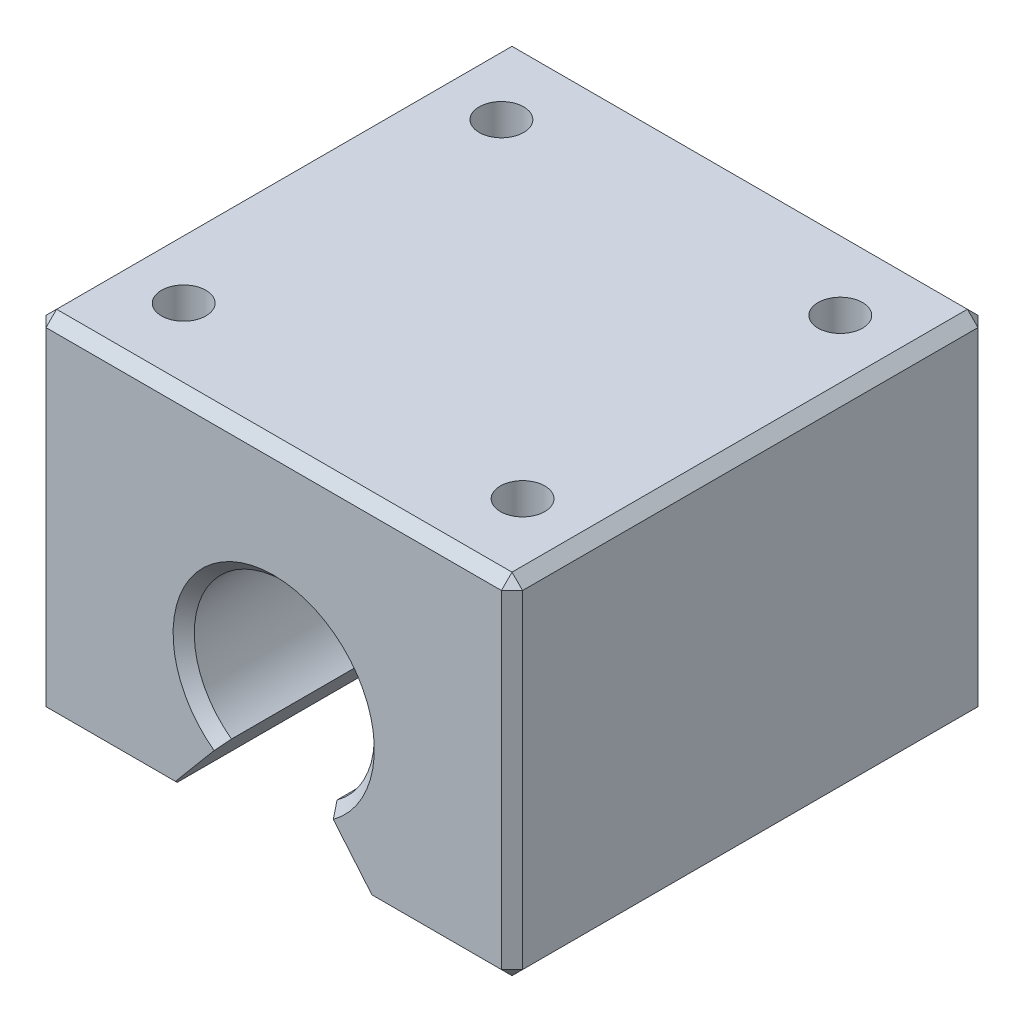
ISO-10303-21;
HEADER;
FILE_DESCRIPTION(('STEP AP214'),'2;1');
FILE_NAME('part.step','',(''),(''),'','','');
FILE_SCHEMA(('AUTOMOTIVE_DESIGN { 1 0 10303 214 1 1 1 1 }'));
ENDSEC;
DATA;
#1=APPLICATION_CONTEXT('core data for automotive mechanical design processes');
#2=APPLICATION_PROTOCOL_DEFINITION('international standard','automotive_design',2000,#1);
#3=PRODUCT_CONTEXT('',#1,'mechanical');
#4=PRODUCT('Part','Part','',(#3));
#5=PRODUCT_RELATED_PRODUCT_CATEGORY('part','',(#4));
#6=PRODUCT_DEFINITION_FORMATION('','',#4);
#7=PRODUCT_DEFINITION_CONTEXT('part definition',#1,'design');
#8=PRODUCT_DEFINITION('design','',#6,#7);
#9=PRODUCT_DEFINITION_SHAPE('','',#8);
#10=(LENGTH_UNIT() NAMED_UNIT(*) SI_UNIT(.MILLI.,.METRE.));
#11=(NAMED_UNIT(*) PLANE_ANGLE_UNIT() SI_UNIT($,.RADIAN.));
#12=(NAMED_UNIT(*) SI_UNIT($,.STERADIAN.) SOLID_ANGLE_UNIT());
#13=UNCERTAINTY_MEASURE_WITH_UNIT(LENGTH_MEASURE(1.E-05),#10,'distance_accuracy_value','');
#14=(GEOMETRIC_REPRESENTATION_CONTEXT(3) GLOBAL_UNCERTAINTY_ASSIGNED_CONTEXT((#13)) GLOBAL_UNIT_ASSIGNED_CONTEXT((#10,
#11,#12)) REPRESENTATION_CONTEXT('',''));
#15=CARTESIAN_POINT('',(0.,0.,0.));
#16=DIRECTION('',(0.,0.,1.));
#17=DIRECTION('',(1.,0.,0.));
#18=AXIS2_PLACEMENT_3D('',#15,#16,#17);
#19=CARTESIAN_POINT('',(-22.5,-16.5,45.));
#20=DIRECTION('',(0.,1.,0.));
#21=DIRECTION('',(0.,0.,1.));
#22=AXIS2_PLACEMENT_3D('',#19,#20,#21);
#23=PLANE('',#22);
#24=DIRECTION('',(0.,0.,1.));
#25=VECTOR('',#24,1.);
#26=CARTESIAN_POINT('',(21.5,-16.5,45.));
#27=LINE('',#26,#25);
#28=CARTESIAN_POINT('',(21.5,-16.5,1.));
#29=VERTEX_POINT('',#28);
#30=CARTESIAN_POINT('',(21.5,-16.5,44.));
#31=VERTEX_POINT('',#30);
#32=EDGE_CURVE('E337',#29,#31,#27,.T.);
#33=ORIENTED_EDGE('',*,*,#32,.T.);
#34=DIRECTION('',(-1.,0.,0.));
#35=VECTOR('',#34,1.);
#36=CARTESIAN_POINT('',(-22.5,-16.5,44.));
#37=LINE('',#36,#35);
#38=CARTESIAN_POINT('',(10.1133686516864,-16.5,44.));
#39=VERTEX_POINT('',#38);
#40=EDGE_CURVE('E339',#31,#39,#37,.T.);
#41=ORIENTED_EDGE('',*,*,#40,.T.);
#42=DIRECTION('',(0.,0.,-1.));
#43=VECTOR('',#42,1.);
#44=CARTESIAN_POINT('',(10.1133686516864,-16.5,45.));
#45=LINE('',#44,#43);
#46=CARTESIAN_POINT('',(10.1133686516864,-16.5,1.));
#47=VERTEX_POINT('',#46);
#48=EDGE_CURVE('E229',#39,#47,#45,.T.);
#49=ORIENTED_EDGE('',*,*,#48,.T.);
#50=DIRECTION('',(1.,0.,0.));
#51=VECTOR('',#50,1.);
#52=CARTESIAN_POINT('',(22.5,-16.5,1.));
#53=LINE('',#52,#51);
#54=EDGE_CURVE('E335',#47,#29,#53,.T.);
#55=ORIENTED_EDGE('',*,*,#54,.T.);
#56=EDGE_LOOP('',(#33,#41,#49,#55));
#57=FACE_BOUND('',#56,.T.);
#58=ADVANCED_FACE('F32',(#57),#23,.F.);
#59=CARTESIAN_POINT('',(22.5,-16.5,45.));
#60=DIRECTION('',(-1.,0.,0.));
#61=DIRECTION('',(0.,0.,1.));
#62=AXIS2_PLACEMENT_3D('',#59,#60,#61);
#63=PLANE('',#62);
#64=DIRECTION('',(0.,-1.,0.));
#65=VECTOR('',#64,1.);
#66=CARTESIAN_POINT('',(22.5,-16.5,44.));
#67=LINE('',#66,#65);
#68=CARTESIAN_POINT('',(22.5,15.5,44.));
#69=VERTEX_POINT('',#68);
#70=CARTESIAN_POINT('',(22.5,-15.5,44.));
#71=VERTEX_POINT('',#70);
#72=EDGE_CURVE('E360',#69,#71,#67,.T.);
#73=ORIENTED_EDGE('',*,*,#72,.T.);
#74=DIRECTION('',(0.,0.,-1.));
#75=VECTOR('',#74,1.);
#76=CARTESIAN_POINT('',(22.5,-15.5,45.));
#77=LINE('',#76,#75);
#78=CARTESIAN_POINT('',(22.5,-15.5,1.));
#79=VERTEX_POINT('',#78);
#80=EDGE_CURVE('E362',#71,#79,#77,.T.);
#81=ORIENTED_EDGE('',*,*,#80,.T.);
#82=DIRECTION('',(0.,1.,0.));
#83=VECTOR('',#82,1.);
#84=CARTESIAN_POINT('',(22.5,16.5,1.));
#85=LINE('',#84,#83);
#86=CARTESIAN_POINT('',(22.5,15.5,1.));
#87=VERTEX_POINT('',#86);
#88=EDGE_CURVE('E356',#79,#87,#85,.T.);
#89=ORIENTED_EDGE('',*,*,#88,.T.);
#90=DIRECTION('',(0.,0.,1.));
#91=VECTOR('',#90,1.);
#92=CARTESIAN_POINT('',(22.5,15.5,45.));
#93=LINE('',#92,#91);
#94=EDGE_CURVE('E358',#87,#69,#93,.T.);
#95=ORIENTED_EDGE('',*,*,#94,.T.);
#96=EDGE_LOOP('',(#73,#81,#89,#95));
#97=FACE_BOUND('',#96,.T.);
#98=ADVANCED_FACE('F302',(#97),#63,.F.);
#99=CARTESIAN_POINT('',(-22.5,16.5,45.));
#100=DIRECTION('',(0.,-1.,0.));
#101=DIRECTION('',(0.,0.,-1.));
#102=AXIS2_PLACEMENT_3D('',#99,#100,#101);
#103=PLANE('',#102);
#104=DIRECTION('',(0.,0.,-1.));
#105=VECTOR('',#104,1.);
#106=CARTESIAN_POINT('',(21.5,16.5,45.));
#107=LINE('',#106,#105);
#108=CARTESIAN_POINT('',(21.5,16.5,44.));
#109=VERTEX_POINT('',#108);
#110=CARTESIAN_POINT('',(21.5,16.5,1.));
#111=VERTEX_POINT('',#110);
#112=EDGE_CURVE('E365',#109,#111,#107,.T.);
#113=ORIENTED_EDGE('',*,*,#112,.T.);
#114=DIRECTION('',(-1.,0.,0.));
#115=VECTOR('',#114,1.);
#116=CARTESIAN_POINT('',(-22.5,16.5,1.));
#117=LINE('',#116,#115);
#118=CARTESIAN_POINT('',(-21.5,16.5,1.));
#119=VERTEX_POINT('',#118);
#120=EDGE_CURVE('E11',#111,#119,#117,.T.);
#121=ORIENTED_EDGE('',*,*,#120,.T.);
#122=DIRECTION('',(0.,0.,1.));
#123=VECTOR('',#122,1.);
#124=CARTESIAN_POINT('',(-21.5,16.5,45.));
#125=LINE('',#124,#123);
#126=CARTESIAN_POINT('',(-21.5,16.5,44.));
#127=VERTEX_POINT('',#126);
#128=EDGE_CURVE('E41',#119,#127,#125,.T.);
#129=ORIENTED_EDGE('',*,*,#128,.T.);
#130=DIRECTION('',(1.,0.,0.));
#131=VECTOR('',#130,1.);
#132=CARTESIAN_POINT('',(-22.5,16.5,44.));
#133=LINE('',#132,#131);
#134=EDGE_CURVE('E367',#127,#109,#133,.T.);
#135=ORIENTED_EDGE('',*,*,#134,.T.);
#136=EDGE_LOOP('',(#113,#121,#129,#135));
#137=FACE_BOUND('',#136,.T.);
#138=CARTESIAN_POINT('',(-16.,16.5,7.5));
#139=DIRECTION('',(0.,1.,0.));
#140=DIRECTION('',(0.,0.,1.));
#141=AXIS2_PLACEMENT_3D('',#138,#139,#140);
#142=CIRCLE('',#141,2.09999999999999);
#143=CARTESIAN_POINT('',(-16.,16.5,9.59999999999999));
#144=VERTEX_POINT('',#143);
#145=EDGE_CURVE('E189',#144,#144,#142,.T.);
#146=ORIENTED_EDGE('',*,*,#145,.F.);
#147=EDGE_LOOP('',(#146));
#148=FACE_BOUND('',#147,.T.);
#149=CARTESIAN_POINT('',(16.,16.5,7.5));
#150=DIRECTION('',(0.,1.,0.));
#151=DIRECTION('',(0.,0.,1.));
#152=AXIS2_PLACEMENT_3D('',#149,#150,#151);
#153=CIRCLE('',#152,2.09999999999999);
#154=CARTESIAN_POINT('',(16.,16.5,9.59999999999999));
#155=VERTEX_POINT('',#154);
#156=EDGE_CURVE('E188',#155,#155,#153,.T.);
#157=ORIENTED_EDGE('',*,*,#156,.F.);
#158=EDGE_LOOP('',(#157));
#159=FACE_BOUND('',#158,.T.);
#160=CARTESIAN_POINT('',(16.,16.5,37.5));
#161=DIRECTION('',(0.,1.,0.));
#162=DIRECTION('',(0.,0.,1.));
#163=AXIS2_PLACEMENT_3D('',#160,#161,#162);
#164=CIRCLE('',#163,2.09999999999999);
#165=CARTESIAN_POINT('',(16.,16.5,39.6));
#166=VERTEX_POINT('',#165);
#167=EDGE_CURVE('E199',#166,#166,#164,.T.);
#168=ORIENTED_EDGE('',*,*,#167,.F.);
#169=EDGE_LOOP('',(#168));
#170=FACE_BOUND('',#169,.T.);
#171=CARTESIAN_POINT('',(-16.,16.5,37.5));
#172=DIRECTION('',(0.,1.,0.));
#173=DIRECTION('',(0.,0.,1.));
#174=AXIS2_PLACEMENT_3D('',#171,#172,#173);
#175=CIRCLE('',#174,2.09999999999999);
#176=CARTESIAN_POINT('',(-16.,16.5,39.6));
#177=VERTEX_POINT('',#176);
#178=EDGE_CURVE('E205',#177,#177,#175,.T.);
#179=ORIENTED_EDGE('',*,*,#178,.F.);
#180=EDGE_LOOP('',(#179));
#181=FACE_BOUND('',#180,.T.);
#182=ADVANCED_FACE('F298',(#137,#148,#159,#170,#181),#103,.F.);
#183=CARTESIAN_POINT('',(-22.5,-16.5,45.));
#184=DIRECTION('',(1.,0.,0.));
#185=DIRECTION('',(0.,0.,-1.));
#186=AXIS2_PLACEMENT_3D('',#183,#184,#185);
#187=PLANE('',#186);
#188=DIRECTION('',(0.,-1.,0.));
#189=VECTOR('',#188,1.);
#190=CARTESIAN_POINT('',(-22.5,-16.5,1.));
#191=LINE('',#190,#189);
#192=CARTESIAN_POINT('',(-22.5,15.5,1.));
#193=VERTEX_POINT('',#192);
#194=CARTESIAN_POINT('',(-22.5,-15.5,1.));
#195=VERTEX_POINT('',#194);
#196=EDGE_CURVE('E351',#193,#195,#191,.T.);
#197=ORIENTED_EDGE('',*,*,#196,.T.);
#198=DIRECTION('',(0.,0.,1.));
#199=VECTOR('',#198,1.);
#200=CARTESIAN_POINT('',(-22.5,-15.5,45.));
#201=LINE('',#200,#199);
#202=CARTESIAN_POINT('',(-22.5,-15.5,44.));
#203=VERTEX_POINT('',#202);
#204=EDGE_CURVE('E353',#195,#203,#201,.T.);
#205=ORIENTED_EDGE('',*,*,#204,.T.);
#206=DIRECTION('',(0.,1.,0.));
#207=VECTOR('',#206,1.);
#208=CARTESIAN_POINT('',(-22.5,-16.5,44.));
#209=LINE('',#208,#207);
#210=CARTESIAN_POINT('',(-22.5,15.5,44.));
#211=VERTEX_POINT('',#210);
#212=EDGE_CURVE('E349',#203,#211,#209,.T.);
#213=ORIENTED_EDGE('',*,*,#212,.T.);
#214=DIRECTION('',(0.,0.,-1.));
#215=VECTOR('',#214,1.);
#216=CARTESIAN_POINT('',(-22.5,15.5,45.));
#217=LINE('',#216,#215);
#218=EDGE_CURVE('E347',#211,#193,#217,.T.);
#219=ORIENTED_EDGE('',*,*,#218,.T.);
#220=EDGE_LOOP('',(#197,#205,#213,#219));
#221=FACE_BOUND('',#220,.T.);
#222=ADVANCED_FACE('F294',(#221),#187,.F.);
#223=DIRECTION('',(0.,0.,1.));
#224=VECTOR('',#223,1.);
#225=CARTESIAN_POINT('',(-10.1133686516864,-16.5,45.));
#226=LINE('',#225,#224);
#227=CARTESIAN_POINT('',(-10.1133686516864,-16.5,0.999999999999992));
#228=VERTEX_POINT('',#227);
#229=CARTESIAN_POINT('',(-10.1133686516864,-16.5,44.));
#230=VERTEX_POINT('',#229);
#231=EDGE_CURVE('E224',#228,#230,#226,.T.);
#232=ORIENTED_EDGE('',*,*,#231,.T.);
#233=DIRECTION('',(-1.,0.,0.));
#234=VECTOR('',#233,1.);
#235=CARTESIAN_POINT('',(-22.5,-16.5,44.));
#236=LINE('',#235,#234);
#237=CARTESIAN_POINT('',(-21.5,-16.5,44.));
#238=VERTEX_POINT('',#237);
#239=EDGE_CURVE('E345',#230,#238,#236,.T.);
#240=ORIENTED_EDGE('',*,*,#239,.T.);
#241=DIRECTION('',(0.,0.,-1.));
#242=VECTOR('',#241,1.);
#243=CARTESIAN_POINT('',(-21.5,-16.5,45.));
#244=LINE('',#243,#242);
#245=CARTESIAN_POINT('',(-21.5,-16.5,1.));
#246=VERTEX_POINT('',#245);
#247=EDGE_CURVE('E343',#238,#246,#244,.T.);
#248=ORIENTED_EDGE('',*,*,#247,.T.);
#249=DIRECTION('',(1.,0.,0.));
#250=VECTOR('',#249,1.);
#251=CARTESIAN_POINT('',(-10.1133686516864,-16.5,1.));
#252=LINE('',#251,#250);
#253=EDGE_CURVE('E341',#246,#228,#252,.T.);
#254=ORIENTED_EDGE('',*,*,#253,.T.);
#255=EDGE_LOOP('',(#232,#240,#248,#254));
#256=FACE_BOUND('',#255,.T.);
#257=ADVANCED_FACE('F287',(#256),#23,.F.);
#258=CARTESIAN_POINT('',(22.5,16.5,45.));
#259=DIRECTION('',(0.,0.,-1.));
#260=DIRECTION('',(-1.,0.,0.));
#261=AXIS2_PLACEMENT_3D('',#258,#259,#260);
#262=PLANE('',#261);
#263=DIRECTION('',(-0.642787609686538,-0.766044443118979,0.));
#264=VECTOR('',#263,1.);
#265=CARTESIAN_POINT('',(-21.218120664331,-29.734128105937,45.));
#266=LINE('',#265,#264);
#267=CARTESIAN_POINT('',(-5.62744217919721,-11.1538810102975,45.));
#268=VERTEX_POINT('',#267);
#269=CARTESIAN_POINT('',(-9.27426902050908,-15.5,45.));
#270=VERTEX_POINT('',#269);
#271=EDGE_CURVE('E211',#268,#270,#266,.T.);
#272=ORIENTED_EDGE('',*,*,#271,.F.);
#273=CARTESIAN_POINT('',(0.,-3.49999999999999,45.));
#274=DIRECTION('',(0.,0.,-1.));
#275=DIRECTION('',(-1.,0.,0.));
#276=AXIS2_PLACEMENT_3D('',#273,#274,#275);
#277=CIRCLE('',#276,9.50000000000006);
#278=CARTESIAN_POINT('',(5.62744217919722,-11.1538810102975,45.));
#279=VERTEX_POINT('',#278);
#280=EDGE_CURVE('E333',#268,#279,#277,.T.);
#281=ORIENTED_EDGE('',*,*,#280,.T.);
#282=DIRECTION('',(-0.642787609686538,0.766044443118979,0.));
#283=VECTOR('',#282,1.);
#284=CARTESIAN_POINT('',(21.218120664331,-29.734128105937,45.));
#285=LINE('',#284,#283);
#286=CARTESIAN_POINT('',(9.27426902050911,-15.5,45.));
#287=VERTEX_POINT('',#286);
#288=EDGE_CURVE('E216',#287,#279,#285,.T.);
#289=ORIENTED_EDGE('',*,*,#288,.F.);
#290=DIRECTION('',(1.,0.,0.));
#291=VECTOR('',#290,1.);
#292=CARTESIAN_POINT('',(22.5,-15.5,45.));
#293=LINE('',#292,#291);
#294=CARTESIAN_POINT('',(21.5,-15.5,45.));
#295=VERTEX_POINT('',#294);
#296=EDGE_CURVE('E330',#287,#295,#293,.T.);
#297=ORIENTED_EDGE('',*,*,#296,.T.);
#298=DIRECTION('',(0.,1.,0.));
#299=VECTOR('',#298,1.);
#300=CARTESIAN_POINT('',(21.5,16.5,45.));
#301=LINE('',#300,#299);
#302=CARTESIAN_POINT('',(21.5,15.5,45.));
#303=VERTEX_POINT('',#302);
#304=EDGE_CURVE('E324',#295,#303,#301,.T.);
#305=ORIENTED_EDGE('',*,*,#304,.T.);
#306=DIRECTION('',(-1.,0.,0.));
#307=VECTOR('',#306,1.);
#308=CARTESIAN_POINT('',(22.5,15.5,45.));
#309=LINE('',#308,#307);
#310=CARTESIAN_POINT('',(-21.5,15.5,45.));
#311=VERTEX_POINT('',#310);
#312=EDGE_CURVE('E317',#303,#311,#309,.T.);
#313=ORIENTED_EDGE('',*,*,#312,.T.);
#314=DIRECTION('',(0.,-1.,0.));
#315=VECTOR('',#314,1.);
#316=CARTESIAN_POINT('',(-21.5,16.5,45.));
#317=LINE('',#316,#315);
#318=CARTESIAN_POINT('',(-21.5,-15.5,45.));
#319=VERTEX_POINT('',#318);
#320=EDGE_CURVE('E326',#311,#319,#317,.T.);
#321=ORIENTED_EDGE('',*,*,#320,.T.);
#322=DIRECTION('',(1.,0.,0.));
#323=VECTOR('',#322,1.);
#324=CARTESIAN_POINT('',(22.5,-15.5,45.));
#325=LINE('',#324,#323);
#326=EDGE_CURVE('E328',#319,#270,#325,.T.);
#327=ORIENTED_EDGE('',*,*,#326,.T.);
#328=EDGE_LOOP('',(#272,#281,#289,#297,#305,#313,#321,#327));
#329=FACE_BOUND('',#328,.T.);
#330=ADVANCED_FACE('F283',(#329),#262,.F.);
#331=CARTESIAN_POINT('',(22.5,16.5,0.));
#332=DIRECTION('',(0.,0.,-1.));
#333=DIRECTION('',(-1.,0.,0.));
#334=AXIS2_PLACEMENT_3D('',#331,#332,#333);
#335=PLANE('',#334);
#336=DIRECTION('',(0.642787609686538,-0.766044443118979,0.));
#337=VECTOR('',#336,1.);
#338=CARTESIAN_POINT('',(-1.01810157939162,-3.23403036125723,0.));
#339=LINE('',#338,#337);
#340=CARTESIAN_POINT('',(5.62744217919715,-11.1538810102975,0.));
#341=VERTEX_POINT('',#340);
#342=CARTESIAN_POINT('',(9.27426902050911,-15.5,0.));
#343=VERTEX_POINT('',#342);
#344=EDGE_CURVE('E232',#341,#343,#339,.T.);
#345=ORIENTED_EDGE('',*,*,#344,.F.);
#346=CARTESIAN_POINT('',(0.,-3.49999999999999,0.));
#347=DIRECTION('',(0.,0.,-1.));
#348=DIRECTION('',(-1.,0.,0.));
#349=AXIS2_PLACEMENT_3D('',#346,#347,#348);
#350=CIRCLE('',#349,9.49999999999996);
#351=CARTESIAN_POINT('',(-5.62744217919714,-11.1538810102975,0.));
#352=VERTEX_POINT('',#351);
#353=EDGE_CURVE('E245',#341,#352,#350,.F.);
#354=ORIENTED_EDGE('',*,*,#353,.T.);
#355=DIRECTION('',(-0.642787609686538,-0.766044443118979,0.));
#356=VECTOR('',#355,1.);
#357=CARTESIAN_POINT('',(-21.218120664331,-29.734128105937,0.));
#358=LINE('',#357,#356);
#359=CARTESIAN_POINT('',(-9.27426902050909,-15.5,0.));
#360=VERTEX_POINT('',#359);
#361=EDGE_CURVE('E212',#352,#360,#358,.T.);
#362=ORIENTED_EDGE('',*,*,#361,.T.);
#363=DIRECTION('',(-1.,0.,0.));
#364=VECTOR('',#363,1.);
#365=CARTESIAN_POINT('',(-22.5,-15.5,0.));
#366=LINE('',#365,#364);
#367=CARTESIAN_POINT('',(-21.5,-15.5,0.));
#368=VERTEX_POINT('',#367);
#369=EDGE_CURVE('E243',#360,#368,#366,.T.);
#370=ORIENTED_EDGE('',*,*,#369,.T.);
#371=DIRECTION('',(0.,1.,0.));
#372=VECTOR('',#371,1.);
#373=CARTESIAN_POINT('',(-21.5,16.5,0.));
#374=LINE('',#373,#372);
#375=CARTESIAN_POINT('',(-21.5,15.5,0.));
#376=VERTEX_POINT('',#375);
#377=EDGE_CURVE('E239',#368,#376,#374,.T.);
#378=ORIENTED_EDGE('',*,*,#377,.T.);
#379=DIRECTION('',(1.,0.,0.));
#380=VECTOR('',#379,1.);
#381=CARTESIAN_POINT('',(22.5,15.5,0.));
#382=LINE('',#381,#380);
#383=CARTESIAN_POINT('',(21.5,15.5,0.));
#384=VERTEX_POINT('',#383);
#385=EDGE_CURVE('E237',#376,#384,#382,.T.);
#386=ORIENTED_EDGE('',*,*,#385,.T.);
#387=DIRECTION('',(0.,-1.,0.));
#388=VECTOR('',#387,1.);
#389=CARTESIAN_POINT('',(21.5,-16.5,0.));
#390=LINE('',#389,#388);
#391=CARTESIAN_POINT('',(21.5,-15.5,0.));
#392=VERTEX_POINT('',#391);
#393=EDGE_CURVE('E235',#384,#392,#390,.T.);
#394=ORIENTED_EDGE('',*,*,#393,.T.);
#395=DIRECTION('',(-1.,0.,0.));
#396=VECTOR('',#395,1.);
#397=CARTESIAN_POINT('',(10.1133686516864,-15.5,0.));
#398=LINE('',#397,#396);
#399=EDGE_CURVE('E241',#392,#343,#398,.T.);
#400=ORIENTED_EDGE('',*,*,#399,.T.);
#401=EDGE_LOOP('',(#345,#354,#362,#370,#378,#386,#394,#400));
#402=FACE_BOUND('',#401,.T.);
#403=ADVANCED_FACE('F286',(#402),#335,.T.);
#404=CARTESIAN_POINT('',(21.218120664331,-29.734128105937,0.));
#405=DIRECTION('',(0.766044443118979,0.642787609686538,0.));
#406=DIRECTION('',(-0.642787609686538,0.766044443118979,0.));
#407=AXIS2_PLACEMENT_3D('',#404,#405,#406);
#408=PLANE('',#407);
#409=DIRECTION('',(0.,0.,1.));
#410=VECTOR('',#409,1.);
#411=CARTESIAN_POINT('',(4.98317354561926,-10.3860715516352,0.));
#412=LINE('',#411,#410);
#413=CARTESIAN_POINT('',(4.98317354561926,-10.3860715516352,0.999999999999962));
#414=VERTEX_POINT('',#413);
#415=CARTESIAN_POINT('',(4.98317354561926,-10.3860715516352,43.9999999999999));
#416=VERTEX_POINT('',#415);
#417=EDGE_CURVE('E221',#414,#416,#412,.T.);
#418=ORIENTED_EDGE('',*,*,#417,.F.);
#419=CARTESIAN_POINT('',(4.98317354561926,-10.3860715516352,0.999999999999963));
#420=CARTESIAN_POINT('',(5.09056538018604,-10.5140561562955,0.833354740954877));
#421=CARTESIAN_POINT('',(5.19795035027982,-10.6420325801954,0.666698778079994));
#422=CARTESIAN_POINT('',(5.41270656147245,-10.8979690664161,0.333365444746663));
#423=CARTESIAN_POINT('',(5.52007780257129,-11.0259291287369,0.166688074288225));
#424=CARTESIAN_POINT('',(5.62744217919715,-11.1538810102975,0.));
#425=B_SPLINE_CURVE_WITH_KNOTS('',3,(#419,#420,#421,#422,#423,#424),.UNSPECIFIED.,.F.,.F.,(4,2,
4),(0.,0.707921861183866,1.41584372204479),.UNSPECIFIED.);
#426=EDGE_CURVE('E311',#414,#341,#425,.T.);
#427=ORIENTED_EDGE('',*,*,#426,.T.);
#428=ORIENTED_EDGE('',*,*,#344,.T.);
#429=DIRECTION('',(0.510273605374737,-0.608120402411345,0.608120402411341));
#430=VECTOR('',#429,1.);
#431=CARTESIAN_POINT('',(1.6215273671388,-6.37981764140054,-9.12018235859938));
#432=LINE('',#431,#430);
#433=EDGE_CURVE('E479',#343,#47,#432,.T.);
#434=ORIENTED_EDGE('',*,*,#433,.T.);
#435=ORIENTED_EDGE('',*,*,#48,.F.);
#436=DIRECTION('',(0.510273605374734,-0.608120402411342,-0.608120402411346));
#437=VECTOR('',#436,1.);
#438=CARTESIAN_POINT('',(12.717973642054,-19.6040473545594,40.8959526454406));
#439=LINE('',#438,#437);
#440=EDGE_CURVE('E481',#39,#287,#439,.F.);
#441=ORIENTED_EDGE('',*,*,#440,.T.);
#442=ORIENTED_EDGE('',*,*,#288,.T.);
#443=CARTESIAN_POINT('',(5.62744217919721,-11.1538810102975,45.));
#444=CARTESIAN_POINT('',(5.52007780257134,-11.025929128737,44.8333119257118));
#445=CARTESIAN_POINT('',(5.41270656147249,-10.8979690664161,44.6666345552533));
#446=CARTESIAN_POINT('',(5.19795035027984,-10.6420325801954,44.3333012219199));
#447=CARTESIAN_POINT('',(5.09056538018605,-10.5140561562955,44.166645259045));
#448=CARTESIAN_POINT('',(4.98317354561927,-10.3860715516352,43.9999999999999));
#449=B_SPLINE_CURVE_WITH_KNOTS('',3,(#443,#444,#445,#446,#447,#448),.UNSPECIFIED.,.F.,.F.,(4,2,
4),(0.,0.707921860860989,1.41584372204492),.UNSPECIFIED.);
#450=EDGE_CURVE('E318',#279,#416,#449,.T.);
#451=ORIENTED_EDGE('',*,*,#450,.T.);
#452=EDGE_LOOP('',(#418,#427,#428,#434,#435,#441,#442,#451));
#453=FACE_BOUND('',#452,.T.);
#454=ADVANCED_FACE('F274',(#453),#408,.F.);
#455=CARTESIAN_POINT('',(-21.218120664331,-29.734128105937,0.));
#456=DIRECTION('',(-0.766044443118979,0.642787609686538,0.));
#457=DIRECTION('',(-0.642787609686538,-0.766044443118979,0.));
#458=AXIS2_PLACEMENT_3D('',#455,#456,#457);
#459=PLANE('',#458);
#460=ORIENTED_EDGE('',*,*,#361,.F.);
#461=CARTESIAN_POINT('',(-5.62744217919715,-11.1538810102975,0.));
#462=CARTESIAN_POINT('',(-5.52007780257128,-11.0259291287369,0.166688074288226));
#463=CARTESIAN_POINT('',(-5.41270656147244,-10.8979690664161,0.333365444746663));
#464=CARTESIAN_POINT('',(-5.19795035027982,-10.6420325801954,0.666698778079994));
#465=CARTESIAN_POINT('',(-5.09056538018603,-10.5140561562955,0.833354740954878));
#466=CARTESIAN_POINT('',(-4.98317354561926,-10.3860715516353,0.999999999999963));
#467=B_SPLINE_CURVE_WITH_KNOTS('',3,(#461,#462,#463,#464,#465,#466),.UNSPECIFIED.,.F.,.F.,(4,2,
4),(0.,0.707921860860921,1.41584372204479),.UNSPECIFIED.);
#468=CARTESIAN_POINT('',(-4.98317354561926,-10.3860715516353,0.999999999999962));
#469=VERTEX_POINT('',#468);
#470=EDGE_CURVE('E259',#352,#469,#467,.T.);
#471=ORIENTED_EDGE('',*,*,#470,.T.);
#472=DIRECTION('',(0.,0.,1.));
#473=VECTOR('',#472,1.);
#474=CARTESIAN_POINT('',(-4.98317354561926,-10.3860715516353,0.));
#475=LINE('',#474,#473);
#476=CARTESIAN_POINT('',(-4.98317354561926,-10.3860715516353,43.9999999999999));
#477=VERTEX_POINT('',#476);
#478=EDGE_CURVE('E215',#469,#477,#475,.T.);
#479=ORIENTED_EDGE('',*,*,#478,.T.);
#480=CARTESIAN_POINT('',(-4.98317354561926,-10.3860715516353,43.9999999999999));
#481=CARTESIAN_POINT('',(-5.09056538018604,-10.5140561562955,44.166645259045));
#482=CARTESIAN_POINT('',(-5.19795035027984,-10.6420325801954,44.3333012219199));
#483=CARTESIAN_POINT('',(-5.41270656147248,-10.8979690664162,44.6666345552533));
#484=CARTESIAN_POINT('',(-5.52007780257134,-11.025929128737,44.8333119257118));
#485=CARTESIAN_POINT('',(-5.62744217919721,-11.1538810102975,45.));
#486=B_SPLINE_CURVE_WITH_KNOTS('',3,(#480,#481,#482,#483,#484,#485),.UNSPECIFIED.,.F.,.F.,(4,2,
4),(0.,0.707921861183937,1.41584372204493),.UNSPECIFIED.);
#487=EDGE_CURVE('E252',#477,#268,#486,.T.);
#488=ORIENTED_EDGE('',*,*,#487,.T.);
#489=ORIENTED_EDGE('',*,*,#271,.T.);
#490=DIRECTION('',(0.510273605374734,0.608120402411342,0.608120402411346));
#491=VECTOR('',#490,1.);
#492=CARTESIAN_POINT('',(-1.00091178665814,-5.64019679374278,54.8598032062573));
#493=LINE('',#492,#491);
#494=EDGE_CURVE('E250',#270,#230,#493,.F.);
#495=ORIENTED_EDGE('',*,*,#494,.T.);
#496=ORIENTED_EDGE('',*,*,#231,.F.);
#497=DIRECTION('',(0.510273605374737,0.608120402411345,-0.608120402411341));
#498=VECTOR('',#497,1.);
#499=CARTESIAN_POINT('',(-13.3385892225348,-20.3436682022173,4.8436682022173));
#500=LINE('',#499,#498);
#501=EDGE_CURVE('E248',#228,#360,#500,.T.);
#502=ORIENTED_EDGE('',*,*,#501,.T.);
#503=EDGE_LOOP('',(#460,#471,#479,#488,#489,#495,#496,#502));
#504=FACE_BOUND('',#503,.T.);
#505=ADVANCED_FACE('F268',(#504),#459,.F.);
#506=CARTESIAN_POINT('',(0.,-3.49999999999999,0.));
#507=DIRECTION('',(0.,0.,1.));
#508=DIRECTION('',(1.,0.,0.));
#509=AXIS2_PLACEMENT_3D('',#506,#507,#508);
#510=CYLINDRICAL_SURFACE('',#509,8.5);
#511=ORIENTED_EDGE('',*,*,#478,.F.);
#512=CARTESIAN_POINT('',(0.,-3.49999999999999,0.999999999999963));
#513=DIRECTION('',(0.,0.,-1.));
#514=DIRECTION('',(-1.,0.,0.));
#515=AXIS2_PLACEMENT_3D('',#512,#513,#514);
#516=CIRCLE('',#515,8.5);
#517=EDGE_CURVE('E475',#469,#414,#516,.T.);
#518=ORIENTED_EDGE('',*,*,#517,.T.);
#519=ORIENTED_EDGE('',*,*,#417,.T.);
#520=CARTESIAN_POINT('',(0.,-3.49999999999999,43.9999999999999));
#521=DIRECTION('',(0.,0.,-1.));
#522=DIRECTION('',(-1.,0.,0.));
#523=AXIS2_PLACEMENT_3D('',#520,#521,#522);
#524=CIRCLE('',#523,8.5);
#525=EDGE_CURVE('E473',#416,#477,#524,.F.);
#526=ORIENTED_EDGE('',*,*,#525,.T.);
#527=EDGE_LOOP('',(#511,#518,#519,#526));
#528=FACE_BOUND('',#527,.T.);
#529=ADVANCED_FACE('F273',(#528),#510,.F.);
#530=CARTESIAN_POINT('',(-16.,6.50000000000001,37.5));
#531=DIRECTION('',(0.,1.,0.));
#532=DIRECTION('',(0.,0.,1.));
#533=AXIS2_PLACEMENT_3D('',#530,#531,#532);
#534=CONICAL_SURFACE('',#533,2.1,1.02974425867665);
#535=CARTESIAN_POINT('',(-16.,5.23819270004213,37.5));
#536=VERTEX_POINT('',#535);
#537=VERTEX_LOOP('',#536);
#538=FACE_BOUND('',#537,.T.);
#539=CARTESIAN_POINT('',(-16.,6.50000000000001,37.5));
#540=DIRECTION('',(0.,1.,0.));
#541=DIRECTION('',(0.,0.,1.));
#542=AXIS2_PLACEMENT_3D('',#539,#540,#541);
#543=CIRCLE('',#542,2.1);
#544=CARTESIAN_POINT('',(-16.,6.50000000000001,39.6));
#545=VERTEX_POINT('',#544);
#546=EDGE_CURVE('E208',#545,#545,#543,.T.);
#547=ORIENTED_EDGE('',*,*,#546,.T.);
#548=EDGE_LOOP('',(#547));
#549=FACE_BOUND('',#548,.T.);
#550=ADVANCED_FACE('F281',(#538,#549),#534,.F.);
#551=CARTESIAN_POINT('',(-16.,16.5,37.5));
#552=DIRECTION('',(0.,1.,0.));
#553=DIRECTION('',(0.,0.,1.));
#554=AXIS2_PLACEMENT_3D('',#551,#552,#553);
#555=CYLINDRICAL_SURFACE('',#554,2.09999999999999);
#556=ORIENTED_EDGE('',*,*,#546,.F.);
#557=EDGE_LOOP('',(#556));
#558=FACE_BOUND('',#557,.T.);
#559=ORIENTED_EDGE('',*,*,#178,.T.);
#560=EDGE_LOOP('',(#559));
#561=FACE_BOUND('',#560,.T.);
#562=ADVANCED_FACE('F777',(#558,#561),#555,.F.);
#563=CARTESIAN_POINT('',(16.,6.50000000000001,37.5));
#564=DIRECTION('',(0.,1.,0.));
#565=DIRECTION('',(0.,0.,1.));
#566=AXIS2_PLACEMENT_3D('',#563,#564,#565);
#567=CONICAL_SURFACE('',#566,2.1,1.02974425867665);
#568=CARTESIAN_POINT('',(16.,5.23819270004213,37.5));
#569=VERTEX_POINT('',#568);
#570=VERTEX_LOOP('',#569);
#571=FACE_BOUND('',#570,.T.);
#572=CARTESIAN_POINT('',(16.,6.50000000000001,37.5));
#573=DIRECTION('',(0.,1.,0.));
#574=DIRECTION('',(0.,0.,1.));
#575=AXIS2_PLACEMENT_3D('',#572,#573,#574);
#576=CIRCLE('',#575,2.1);
#577=CARTESIAN_POINT('',(16.,6.50000000000001,39.6));
#578=VERTEX_POINT('',#577);
#579=EDGE_CURVE('E202',#578,#578,#576,.T.);
#580=ORIENTED_EDGE('',*,*,#579,.T.);
#581=EDGE_LOOP('',(#580));
#582=FACE_BOUND('',#581,.T.);
#583=ADVANCED_FACE('F767',(#571,#582),#567,.F.);
#584=CARTESIAN_POINT('',(16.,16.5,37.5));
#585=DIRECTION('',(0.,1.,0.));
#586=DIRECTION('',(0.,0.,1.));
#587=AXIS2_PLACEMENT_3D('',#584,#585,#586);
#588=CYLINDRICAL_SURFACE('',#587,2.09999999999999);
#589=ORIENTED_EDGE('',*,*,#579,.F.);
#590=EDGE_LOOP('',(#589));
#591=FACE_BOUND('',#590,.T.);
#592=ORIENTED_EDGE('',*,*,#167,.T.);
#593=EDGE_LOOP('',(#592));
#594=FACE_BOUND('',#593,.T.);
#595=ADVANCED_FACE('F758',(#591,#594),#588,.F.);
#596=CARTESIAN_POINT('',(16.,6.50000000000001,7.5));
#597=DIRECTION('',(0.,1.,0.));
#598=DIRECTION('',(0.,0.,1.));
#599=AXIS2_PLACEMENT_3D('',#596,#597,#598);
#600=CONICAL_SURFACE('',#599,2.1,1.02974425867665);
#601=CARTESIAN_POINT('',(16.,5.23819270004213,7.5));
#602=VERTEX_POINT('',#601);
#603=VERTEX_LOOP('',#602);
#604=FACE_BOUND('',#603,.T.);
#605=CARTESIAN_POINT('',(16.,6.50000000000001,7.5));
#606=DIRECTION('',(0.,1.,0.));
#607=DIRECTION('',(0.,0.,1.));
#608=AXIS2_PLACEMENT_3D('',#605,#606,#607);
#609=CIRCLE('',#608,2.1);
#610=CARTESIAN_POINT('',(16.,6.50000000000001,9.59999999999999));
#611=VERTEX_POINT('',#610);
#612=EDGE_CURVE('E192',#611,#611,#609,.T.);
#613=ORIENTED_EDGE('',*,*,#612,.T.);
#614=EDGE_LOOP('',(#613));
#615=FACE_BOUND('',#614,.T.);
#616=ADVANCED_FACE('F748',(#604,#615),#600,.F.);
#617=CARTESIAN_POINT('',(16.,16.5,7.5));
#618=DIRECTION('',(0.,1.,0.));
#619=DIRECTION('',(0.,0.,1.));
#620=AXIS2_PLACEMENT_3D('',#617,#618,#619);
#621=CYLINDRICAL_SURFACE('',#620,2.09999999999999);
#622=ORIENTED_EDGE('',*,*,#612,.F.);
#623=EDGE_LOOP('',(#622));
#624=FACE_BOUND('',#623,.T.);
#625=ORIENTED_EDGE('',*,*,#156,.T.);
#626=EDGE_LOOP('',(#625));
#627=FACE_BOUND('',#626,.T.);
#628=ADVANCED_FACE('F182',(#624,#627),#621,.F.);
#629=CARTESIAN_POINT('',(-16.,6.50000000000001,7.5));
#630=DIRECTION('',(0.,1.,0.));
#631=DIRECTION('',(0.,0.,1.));
#632=AXIS2_PLACEMENT_3D('',#629,#630,#631);
#633=CONICAL_SURFACE('',#632,2.1,1.02974425867665);
#634=CARTESIAN_POINT('',(-16.,5.23819270004213,7.5));
#635=VERTEX_POINT('',#634);
#636=VERTEX_LOOP('',#635);
#637=FACE_BOUND('',#636,.T.);
#638=CARTESIAN_POINT('',(-16.,6.50000000000001,7.5));
#639=DIRECTION('',(0.,1.,0.));
#640=DIRECTION('',(0.,0.,1.));
#641=AXIS2_PLACEMENT_3D('',#638,#639,#640);
#642=CIRCLE('',#641,2.1);
#643=CARTESIAN_POINT('',(-16.,6.50000000000001,9.6));
#644=VERTEX_POINT('',#643);
#645=EDGE_CURVE('E186',#644,#644,#642,.T.);
#646=ORIENTED_EDGE('',*,*,#645,.T.);
#647=EDGE_LOOP('',(#646));
#648=FACE_BOUND('',#647,.T.);
#649=ADVANCED_FACE('F178',(#637,#648),#633,.F.);
#650=CARTESIAN_POINT('',(-16.,16.5,7.5));
#651=DIRECTION('',(0.,1.,0.));
#652=DIRECTION('',(0.,0.,1.));
#653=AXIS2_PLACEMENT_3D('',#650,#651,#652);
#654=CYLINDRICAL_SURFACE('',#653,2.09999999999999);
#655=ORIENTED_EDGE('',*,*,#645,.F.);
#656=EDGE_LOOP('',(#655));
#657=FACE_BOUND('',#656,.T.);
#658=ORIENTED_EDGE('',*,*,#145,.T.);
#659=EDGE_LOOP('',(#658));
#660=FACE_BOUND('',#659,.T.);
#661=ADVANCED_FACE('F181',(#657,#660),#654,.F.);
#662=CARTESIAN_POINT('',(0.,-3.49999999999999,0.));
#663=DIRECTION('',(0.,0.,-1.));
#664=DIRECTION('',(-1.,0.,0.));
#665=AXIS2_PLACEMENT_3D('',#662,#663,#664);
#666=CONICAL_SURFACE('',#665,9.49999999999996,0.785398163397446);
#667=ORIENTED_EDGE('',*,*,#426,.F.);
#668=ORIENTED_EDGE('',*,*,#517,.F.);
#669=ORIENTED_EDGE('',*,*,#470,.F.);
#670=ORIENTED_EDGE('',*,*,#353,.F.);
#671=EDGE_LOOP('',(#667,#668,#669,#670));
#672=FACE_BOUND('',#671,.T.);
#673=ADVANCED_FACE('F305',(#672),#666,.F.);
#674=CARTESIAN_POINT('',(0.,-3.49999999999999,43.9999999999999));
#675=DIRECTION('',(0.,0.,1.));
#676=DIRECTION('',(1.,0.,0.));
#677=AXIS2_PLACEMENT_3D('',#674,#675,#676);
#678=CONICAL_SURFACE('',#677,8.5,0.785398163397451);
#679=ORIENTED_EDGE('',*,*,#450,.F.);
#680=ORIENTED_EDGE('',*,*,#280,.F.);
#681=ORIENTED_EDGE('',*,*,#487,.F.);
#682=ORIENTED_EDGE('',*,*,#525,.F.);
#683=EDGE_LOOP('',(#679,#680,#681,#682));
#684=FACE_BOUND('',#683,.T.);
#685=ADVANCED_FACE('F265',(#684),#678,.F.);
#686=CARTESIAN_POINT('',(-22.5,-16.5,1.));
#687=DIRECTION('',(0.,-0.707106781186545,-0.70710678118655));
#688=DIRECTION('',(0.,0.70710678118655,-0.707106781186545));
#689=AXIS2_PLACEMENT_3D('',#686,#687,#688);
#690=PLANE('',#689);
#691=DIRECTION('',(0.,-0.70710678118655,0.707106781186545));
#692=VECTOR('',#691,1.);
#693=CARTESIAN_POINT('',(-21.5,-16.5,1.));
#694=LINE('',#693,#692);
#695=EDGE_CURVE('E36',#368,#246,#694,.T.);
#696=ORIENTED_EDGE('',*,*,#695,.F.);
#697=ORIENTED_EDGE('',*,*,#369,.F.);
#698=ORIENTED_EDGE('',*,*,#501,.F.);
#699=ORIENTED_EDGE('',*,*,#253,.F.);
#700=EDGE_LOOP('',(#696,#697,#698,#699));
#701=FACE_BOUND('',#700,.T.);
#702=ADVANCED_FACE('F34',(#701),#690,.T.);
#703=CARTESIAN_POINT('',(-21.5,-16.5,1.));
#704=DIRECTION('',(-0.577350269189626,-0.577350269189622,-0.57735026918963));
#705=DIRECTION('',(-0.70710678118655,0.,0.707106781186545));
#706=AXIS2_PLACEMENT_3D('',#703,#704,#705);
#707=PLANE('',#706);
#708=DIRECTION('',(0.70710678118655,0.,-0.707106781186545));
#709=VECTOR('',#708,1.);
#710=CARTESIAN_POINT('',(-22.,-15.5,0.500000000000001));
#711=LINE('',#710,#709);
#712=EDGE_CURVE('E430',#368,#195,#711,.F.);
#713=ORIENTED_EDGE('',*,*,#712,.F.);
#714=ORIENTED_EDGE('',*,*,#695,.T.);
#715=DIRECTION('',(0.707106781186545,-0.70710678118655,0.));
#716=VECTOR('',#715,1.);
#717=CARTESIAN_POINT('',(-21.5,-16.5,1.));
#718=LINE('',#717,#716);
#719=EDGE_CURVE('E432',#195,#246,#718,.T.);
#720=ORIENTED_EDGE('',*,*,#719,.F.);
#721=EDGE_LOOP('',(#713,#714,#720));
#722=FACE_BOUND('',#721,.T.);
#723=ADVANCED_FACE('F442',(#722),#707,.T.);
#724=CARTESIAN_POINT('',(22.5,-15.5,45.));
#725=DIRECTION('',(0.,0.70710678118655,-0.707106781186545));
#726=DIRECTION('',(0.,0.707106781186545,0.70710678118655));
#727=AXIS2_PLACEMENT_3D('',#724,#725,#726);
#728=PLANE('',#727);
#729=ORIENTED_EDGE('',*,*,#494,.F.);
#730=ORIENTED_EDGE('',*,*,#326,.F.);
#731=DIRECTION('',(0.,-0.707106781186545,-0.70710678118655));
#732=VECTOR('',#731,1.);
#733=CARTESIAN_POINT('',(-21.5,-16.5,44.));
#734=LINE('',#733,#732);
#735=EDGE_CURVE('E427',#238,#319,#734,.F.);
#736=ORIENTED_EDGE('',*,*,#735,.F.);
#737=ORIENTED_EDGE('',*,*,#239,.F.);
#738=EDGE_LOOP('',(#729,#730,#736,#737));
#739=FACE_BOUND('',#738,.T.);
#740=ADVANCED_FACE('F455',(#739),#728,.F.);
#741=CARTESIAN_POINT('',(-21.5,-16.5,45.));
#742=DIRECTION('',(0.70710678118655,0.707106781186545,0.));
#743=DIRECTION('',(-0.707106781186545,0.70710678118655,0.));
#744=AXIS2_PLACEMENT_3D('',#741,#742,#743);
#745=PLANE('',#744);
#746=ORIENTED_EDGE('',*,*,#719,.T.);
#747=ORIENTED_EDGE('',*,*,#247,.F.);
#748=DIRECTION('',(-0.707106781186545,0.70710678118655,0.));
#749=VECTOR('',#748,1.);
#750=CARTESIAN_POINT('',(-21.5,-16.5,44.));
#751=LINE('',#750,#749);
#752=EDGE_CURVE('E424',#203,#238,#751,.F.);
#753=ORIENTED_EDGE('',*,*,#752,.F.);
#754=ORIENTED_EDGE('',*,*,#204,.F.);
#755=EDGE_LOOP('',(#746,#747,#753,#754));
#756=FACE_BOUND('',#755,.T.);
#757=ADVANCED_FACE('F458',(#756),#745,.F.);
#758=CARTESIAN_POINT('',(-22.5,-16.5,1.));
#759=DIRECTION('',(-0.707106781186545,0.,-0.70710678118655));
#760=DIRECTION('',(-0.70710678118655,0.,0.707106781186545));
#761=AXIS2_PLACEMENT_3D('',#758,#759,#760);
#762=PLANE('',#761);
#763=ORIENTED_EDGE('',*,*,#712,.T.);
#764=ORIENTED_EDGE('',*,*,#196,.F.);
#765=DIRECTION('',(-0.70710678118655,0.,0.707106781186545));
#766=VECTOR('',#765,1.);
#767=CARTESIAN_POINT('',(-21.5,15.5,0.));
#768=LINE('',#767,#766);
#769=EDGE_CURVE('E421',#376,#193,#768,.T.);
#770=ORIENTED_EDGE('',*,*,#769,.F.);
#771=ORIENTED_EDGE('',*,*,#377,.F.);
#772=EDGE_LOOP('',(#763,#764,#770,#771));
#773=FACE_BOUND('',#772,.T.);
#774=ADVANCED_FACE('F465',(#773),#762,.T.);
#775=CARTESIAN_POINT('',(-21.5,-16.5,44.));
#776=DIRECTION('',(-0.57735026918963,-0.577350269189626,0.577350269189622));
#777=DIRECTION('',(0.707106781186545,-0.70710678118655,0.));
#778=AXIS2_PLACEMENT_3D('',#775,#776,#777);
#779=PLANE('',#778);
#780=ORIENTED_EDGE('',*,*,#752,.T.);
#781=ORIENTED_EDGE('',*,*,#735,.T.);
#782=DIRECTION('',(0.707106781186545,0.,0.70710678118655));
#783=VECTOR('',#782,1.);
#784=CARTESIAN_POINT('',(-22.,-15.5,44.5));
#785=LINE('',#784,#783);
#786=EDGE_CURVE('E418',#203,#319,#785,.T.);
#787=ORIENTED_EDGE('',*,*,#786,.F.);
#788=EDGE_LOOP('',(#780,#781,#787));
#789=FACE_BOUND('',#788,.T.);
#790=ADVANCED_FACE('F675',(#789),#779,.T.);
#791=CARTESIAN_POINT('',(-21.5,15.5,0.));
#792=DIRECTION('',(-0.577350269189624,0.577350269189624,-0.577350269189628));
#793=DIRECTION('',(-0.70710678118655,0.,0.707106781186545));
#794=AXIS2_PLACEMENT_3D('',#791,#792,#793);
#795=PLANE('',#794);
#796=DIRECTION('',(0.,-0.70710678118655,-0.707106781186545));
#797=VECTOR('',#796,1.);
#798=CARTESIAN_POINT('',(-21.5,15.5,0.));
#799=LINE('',#798,#797);
#800=EDGE_CURVE('E413',#376,#119,#799,.F.);
#801=ORIENTED_EDGE('',*,*,#800,.F.);
#802=ORIENTED_EDGE('',*,*,#769,.T.);
#803=DIRECTION('',(-0.707106781186547,-0.707106781186547,0.));
#804=VECTOR('',#803,1.);
#805=CARTESIAN_POINT('',(-22.,16.,1.));
#806=LINE('',#805,#804);
#807=EDGE_CURVE('E416',#119,#193,#806,.T.);
#808=ORIENTED_EDGE('',*,*,#807,.F.);
#809=EDGE_LOOP('',(#801,#802,#808));
#810=FACE_BOUND('',#809,.T.);
#811=ADVANCED_FACE('F518',(#810),#795,.T.);
#812=CARTESIAN_POINT('',(-21.5,16.5,45.));
#813=DIRECTION('',(0.70710678118655,0.,-0.707106781186545));
#814=DIRECTION('',(-0.707106781186545,0.,-0.70710678118655));
#815=AXIS2_PLACEMENT_3D('',#812,#813,#814);
#816=PLANE('',#815);
#817=ORIENTED_EDGE('',*,*,#786,.T.);
#818=ORIENTED_EDGE('',*,*,#320,.F.);
#819=DIRECTION('',(-0.707106781186545,0.,-0.70710678118655));
#820=VECTOR('',#819,1.);
#821=CARTESIAN_POINT('',(-22.5,15.5,44.));
#822=LINE('',#821,#820);
#823=EDGE_CURVE('E410',#211,#311,#822,.F.);
#824=ORIENTED_EDGE('',*,*,#823,.F.);
#825=ORIENTED_EDGE('',*,*,#212,.F.);
#826=EDGE_LOOP('',(#817,#818,#824,#825));
#827=FACE_BOUND('',#826,.T.);
#828=ADVANCED_FACE('F494',(#827),#816,.F.);
#829=CARTESIAN_POINT('',(-22.5,15.5,45.));
#830=DIRECTION('',(0.707106781186547,-0.707106781186547,0.));
#831=DIRECTION('',(0.707106781186548,0.707106781186548,0.));
#832=AXIS2_PLACEMENT_3D('',#829,#830,#831);
#833=PLANE('',#832);
#834=ORIENTED_EDGE('',*,*,#807,.T.);
#835=ORIENTED_EDGE('',*,*,#218,.F.);
#836=DIRECTION('',(0.707106781186547,0.707106781186547,0.));
#837=VECTOR('',#836,1.);
#838=CARTESIAN_POINT('',(-22.5,15.5,44.));
#839=LINE('',#838,#837);
#840=EDGE_CURVE('E407',#127,#211,#839,.F.);
#841=ORIENTED_EDGE('',*,*,#840,.F.);
#842=ORIENTED_EDGE('',*,*,#128,.F.);
#843=EDGE_LOOP('',(#834,#835,#841,#842));
#844=FACE_BOUND('',#843,.T.);
#845=ADVANCED_FACE('F519',(#844),#833,.F.);
#846=CARTESIAN_POINT('',(-22.5,16.5,1.));
#847=DIRECTION('',(0.,0.707106781186545,-0.70710678118655));
#848=DIRECTION('',(0.,0.70710678118655,0.707106781186545));
#849=AXIS2_PLACEMENT_3D('',#846,#847,#848);
#850=PLANE('',#849);
#851=ORIENTED_EDGE('',*,*,#800,.T.);
#852=ORIENTED_EDGE('',*,*,#120,.F.);
#853=DIRECTION('',(0.,0.70710678118655,0.707106781186545));
#854=VECTOR('',#853,1.);
#855=CARTESIAN_POINT('',(21.5,15.5,0.));
#856=LINE('',#855,#854);
#857=EDGE_CURVE('E404',#384,#111,#856,.T.);
#858=ORIENTED_EDGE('',*,*,#857,.F.);
#859=ORIENTED_EDGE('',*,*,#385,.F.);
#860=EDGE_LOOP('',(#851,#852,#858,#859));
#861=FACE_BOUND('',#860,.T.);
#862=ADVANCED_FACE('F516',(#861),#850,.T.);
#863=CARTESIAN_POINT('',(-22.5,15.5,44.));
#864=DIRECTION('',(-0.577350269189629,0.577350269189629,0.57735026918962));
#865=DIRECTION('',(-0.707106781186547,-0.707106781186547,0.));
#866=AXIS2_PLACEMENT_3D('',#863,#864,#865);
#867=PLANE('',#866);
#868=ORIENTED_EDGE('',*,*,#840,.T.);
#869=ORIENTED_EDGE('',*,*,#823,.T.);
#870=DIRECTION('',(0.,-0.707106781186545,0.70710678118655));
#871=VECTOR('',#870,1.);
#872=CARTESIAN_POINT('',(-21.5,16.,44.5));
#873=LINE('',#872,#871);
#874=EDGE_CURVE('E401',#127,#311,#873,.T.);
#875=ORIENTED_EDGE('',*,*,#874,.F.);
#876=EDGE_LOOP('',(#868,#869,#875));
#877=FACE_BOUND('',#876,.T.);
#878=ADVANCED_FACE('F497',(#877),#867,.T.);
#879=CARTESIAN_POINT('',(21.5,15.5,0.));
#880=DIRECTION('',(0.577350269189623,0.577350269189627,-0.577350269189627));
#881=DIRECTION('',(0.,0.707106781186547,0.707106781186547));
#882=AXIS2_PLACEMENT_3D('',#879,#880,#881);
#883=PLANE('',#882);
#884=DIRECTION('',(-0.70710678118655,0.,-0.707106781186545));
#885=VECTOR('',#884,1.);
#886=CARTESIAN_POINT('',(21.5,15.5,0.));
#887=LINE('',#886,#885);
#888=EDGE_CURVE('E395',#384,#87,#887,.F.);
#889=ORIENTED_EDGE('',*,*,#888,.F.);
#890=ORIENTED_EDGE('',*,*,#857,.T.);
#891=DIRECTION('',(-0.70710678118655,0.707106781186545,0.));
#892=VECTOR('',#891,1.);
#893=CARTESIAN_POINT('',(22.,16.,1.));
#894=LINE('',#893,#892);
#895=EDGE_CURVE('E398',#87,#111,#894,.T.);
#896=ORIENTED_EDGE('',*,*,#895,.F.);
#897=EDGE_LOOP('',(#889,#890,#896));
#898=FACE_BOUND('',#897,.T.);
#899=ADVANCED_FACE('F513',(#898),#883,.T.);
#900=CARTESIAN_POINT('',(22.5,15.5,45.));
#901=DIRECTION('',(0.,-0.70710678118655,-0.707106781186545));
#902=DIRECTION('',(0.,0.707106781186545,-0.70710678118655));
#903=AXIS2_PLACEMENT_3D('',#900,#901,#902);
#904=PLANE('',#903);
#905=ORIENTED_EDGE('',*,*,#874,.T.);
#906=ORIENTED_EDGE('',*,*,#312,.F.);
#907=DIRECTION('',(0.,0.707106781186545,-0.70710678118655));
#908=VECTOR('',#907,1.);
#909=CARTESIAN_POINT('',(21.5,15.5,45.));
#910=LINE('',#909,#908);
#911=EDGE_CURVE('E392',#109,#303,#910,.F.);
#912=ORIENTED_EDGE('',*,*,#911,.F.);
#913=ORIENTED_EDGE('',*,*,#134,.F.);
#914=EDGE_LOOP('',(#905,#906,#912,#913));
#915=FACE_BOUND('',#914,.T.);
#916=ADVANCED_FACE('F500',(#915),#904,.F.);
#917=CARTESIAN_POINT('',(21.5,16.5,45.));
#918=DIRECTION('',(-0.707106781186545,-0.70710678118655,0.));
#919=DIRECTION('',(0.70710678118655,-0.707106781186545,0.));
#920=AXIS2_PLACEMENT_3D('',#917,#918,#919);
#921=PLANE('',#920);
#922=ORIENTED_EDGE('',*,*,#895,.T.);
#923=ORIENTED_EDGE('',*,*,#112,.F.);
#924=DIRECTION('',(0.70710678118655,-0.707106781186545,0.));
#925=VECTOR('',#924,1.);
#926=CARTESIAN_POINT('',(22.,16.,44.));
#927=LINE('',#926,#925);
#928=EDGE_CURVE('E389',#69,#109,#927,.F.);
#929=ORIENTED_EDGE('',*,*,#928,.F.);
#930=ORIENTED_EDGE('',*,*,#94,.F.);
#931=EDGE_LOOP('',(#922,#923,#929,#930));
#932=FACE_BOUND('',#931,.T.);
#933=ADVANCED_FACE('F507',(#932),#921,.F.);
#934=CARTESIAN_POINT('',(22.5,-16.5,1.));
#935=DIRECTION('',(0.707106781186545,0.,-0.70710678118655));
#936=DIRECTION('',(-0.70710678118655,0.,-0.707106781186545));
#937=AXIS2_PLACEMENT_3D('',#934,#935,#936);
#938=PLANE('',#937);
#939=ORIENTED_EDGE('',*,*,#888,.T.);
#940=ORIENTED_EDGE('',*,*,#88,.F.);
#941=DIRECTION('',(0.70710678118655,0.,0.707106781186545));
#942=VECTOR('',#941,1.);
#943=CARTESIAN_POINT('',(22.5,-15.5,1.));
#944=LINE('',#943,#942);
#945=EDGE_CURVE('E386',#392,#79,#944,.T.);
#946=ORIENTED_EDGE('',*,*,#945,.F.);
#947=ORIENTED_EDGE('',*,*,#393,.F.);
#948=EDGE_LOOP('',(#939,#940,#946,#947));
#949=FACE_BOUND('',#948,.T.);
#950=ADVANCED_FACE('F563',(#949),#938,.T.);
#951=CARTESIAN_POINT('',(-22.5,-16.5,1.));
#952=DIRECTION('',(0.,-0.707106781186545,-0.70710678118655));
#953=DIRECTION('',(0.,0.70710678118655,-0.707106781186545));
#954=AXIS2_PLACEMENT_3D('',#951,#952,#953);
#955=PLANE('',#954);
#956=ORIENTED_EDGE('',*,*,#433,.F.);
#957=ORIENTED_EDGE('',*,*,#399,.F.);
#958=DIRECTION('',(0.,0.70710678118655,-0.707106781186545));
#959=VECTOR('',#958,1.);
#960=CARTESIAN_POINT('',(21.5,-16.,0.499999999999997));
#961=LINE('',#960,#959);
#962=EDGE_CURVE('E383',#29,#392,#961,.T.);
#963=ORIENTED_EDGE('',*,*,#962,.F.);
#964=ORIENTED_EDGE('',*,*,#54,.F.);
#965=EDGE_LOOP('',(#956,#957,#963,#964));
#966=FACE_BOUND('',#965,.T.);
#967=ADVANCED_FACE('F555',(#966),#955,.T.);
#968=CARTESIAN_POINT('',(21.5,15.5,45.));
#969=DIRECTION('',(0.577350269189623,0.577350269189631,0.577350269189623));
#970=DIRECTION('',(-0.707106781186552,0.707106781186543,0.));
#971=AXIS2_PLACEMENT_3D('',#968,#969,#970);
#972=PLANE('',#971);
#973=ORIENTED_EDGE('',*,*,#928,.T.);
#974=ORIENTED_EDGE('',*,*,#911,.T.);
#975=DIRECTION('',(-0.70710678118655,0.,0.707106781186545));
#976=VECTOR('',#975,1.);
#977=CARTESIAN_POINT('',(21.5,15.5,45.));
#978=LINE('',#977,#976);
#979=EDGE_CURVE('E380',#69,#303,#978,.T.);
#980=ORIENTED_EDGE('',*,*,#979,.F.);
#981=EDGE_LOOP('',(#973,#974,#980));
#982=FACE_BOUND('',#981,.T.);
#983=ADVANCED_FACE('F552',(#982),#972,.T.);
#984=CARTESIAN_POINT('',(22.5,-15.5,1.));
#985=DIRECTION('',(0.577350269189621,-0.577350269189628,-0.577350269189628));
#986=DIRECTION('',(0.,0.707106781186548,-0.707106781186548));
#987=AXIS2_PLACEMENT_3D('',#984,#985,#986);
#988=PLANE('',#987);
#989=ORIENTED_EDGE('',*,*,#962,.T.);
#990=ORIENTED_EDGE('',*,*,#945,.T.);
#991=DIRECTION('',(0.707106781186552,0.707106781186543,0.));
#992=VECTOR('',#991,1.);
#993=CARTESIAN_POINT('',(22.5,-15.5,1.));
#994=LINE('',#993,#992);
#995=EDGE_CURVE('E378',#29,#79,#994,.T.);
#996=ORIENTED_EDGE('',*,*,#995,.F.);
#997=EDGE_LOOP('',(#989,#990,#996));
#998=FACE_BOUND('',#997,.T.);
#999=ADVANCED_FACE('F554',(#998),#988,.T.);
#1000=CARTESIAN_POINT('',(21.5,16.5,45.));
#1001=DIRECTION('',(-0.707106781186545,0.,-0.70710678118655));
#1002=DIRECTION('',(-0.70710678118655,0.,0.707106781186545));
#1003=AXIS2_PLACEMENT_3D('',#1000,#1001,#1002);
#1004=PLANE('',#1003);
#1005=ORIENTED_EDGE('',*,*,#979,.T.);
#1006=ORIENTED_EDGE('',*,*,#304,.F.);
#1007=DIRECTION('',(0.70710678118655,0.,-0.707106781186545));
#1008=VECTOR('',#1007,1.);
#1009=CARTESIAN_POINT('',(21.5,-15.5,45.));
#1010=LINE('',#1009,#1008);
#1011=EDGE_CURVE('E375',#71,#295,#1010,.F.);
#1012=ORIENTED_EDGE('',*,*,#1011,.F.);
#1013=ORIENTED_EDGE('',*,*,#72,.F.);
#1014=EDGE_LOOP('',(#1005,#1006,#1012,#1013));
#1015=FACE_BOUND('',#1014,.T.);
#1016=ADVANCED_FACE('F550',(#1015),#1004,.F.);
#1017=CARTESIAN_POINT('',(22.5,-15.5,45.));
#1018=DIRECTION('',(-0.707106781186542,0.707106781186552,0.));
#1019=DIRECTION('',(-0.707106781186552,-0.707106781186543,0.));
#1020=AXIS2_PLACEMENT_3D('',#1017,#1018,#1019);
#1021=PLANE('',#1020);
#1022=ORIENTED_EDGE('',*,*,#995,.T.);
#1023=ORIENTED_EDGE('',*,*,#80,.F.);
#1024=DIRECTION('',(-0.707106781186552,-0.707106781186543,0.));
#1025=VECTOR('',#1024,1.);
#1026=CARTESIAN_POINT('',(22.,-16.,44.));
#1027=LINE('',#1026,#1025);
#1028=EDGE_CURVE('E372',#31,#71,#1027,.F.);
#1029=ORIENTED_EDGE('',*,*,#1028,.F.);
#1030=ORIENTED_EDGE('',*,*,#32,.F.);
#1031=EDGE_LOOP('',(#1022,#1023,#1029,#1030));
#1032=FACE_BOUND('',#1031,.T.);
#1033=ADVANCED_FACE('F539',(#1032),#1021,.F.);
#1034=CARTESIAN_POINT('',(21.5,-15.5,45.));
#1035=DIRECTION('',(0.577350269189621,-0.577350269189633,0.577350269189624));
#1036=DIRECTION('',(0.,-0.707106781186542,-0.707106781186552));
#1037=AXIS2_PLACEMENT_3D('',#1034,#1035,#1036);
#1038=PLANE('',#1037);
#1039=ORIENTED_EDGE('',*,*,#1028,.T.);
#1040=ORIENTED_EDGE('',*,*,#1011,.T.);
#1041=DIRECTION('',(0.,0.707106781186545,0.70710678118655));
#1042=VECTOR('',#1041,1.);
#1043=CARTESIAN_POINT('',(21.5,-15.5,45.));
#1044=LINE('',#1043,#1042);
#1045=EDGE_CURVE('E370',#31,#295,#1044,.T.);
#1046=ORIENTED_EDGE('',*,*,#1045,.F.);
#1047=EDGE_LOOP('',(#1039,#1040,#1046));
#1048=FACE_BOUND('',#1047,.T.);
#1049=ADVANCED_FACE('F546',(#1048),#1038,.T.);
#1050=CARTESIAN_POINT('',(22.5,-15.5,45.));
#1051=DIRECTION('',(0.,0.70710678118655,-0.707106781186545));
#1052=DIRECTION('',(0.,0.707106781186545,0.70710678118655));
#1053=AXIS2_PLACEMENT_3D('',#1050,#1051,#1052);
#1054=PLANE('',#1053);
#1055=ORIENTED_EDGE('',*,*,#440,.F.);
#1056=ORIENTED_EDGE('',*,*,#40,.F.);
#1057=ORIENTED_EDGE('',*,*,#1045,.T.);
#1058=ORIENTED_EDGE('',*,*,#296,.F.);
#1059=EDGE_LOOP('',(#1055,#1056,#1057,#1058));
#1060=FACE_BOUND('',#1059,.T.);
#1061=ADVANCED_FACE('F544',(#1060),#1054,.F.);
#1062=CLOSED_SHELL('',(#58,#98,#182,#222,#257,#330,#403,#454,#505,#529,#550,#562,#583,#595,#616,
#628,#649,#661,#673,#685,#702,#723,#740,#757,#774,#790,#811,#828,#845,#862,#878,#899,#916,#933,
#950,#967,#983,#999,#1016,#1033,#1049,#1061));
#1063=MANIFOLD_SOLID_BREP('B2',#1062);
#1064=ADVANCED_BREP_SHAPE_REPRESENTATION('',(#18,#1063),#14);
#1065=SHAPE_DEFINITION_REPRESENTATION(#9,#1064);
ENDSEC;
END-ISO-10303-21;
